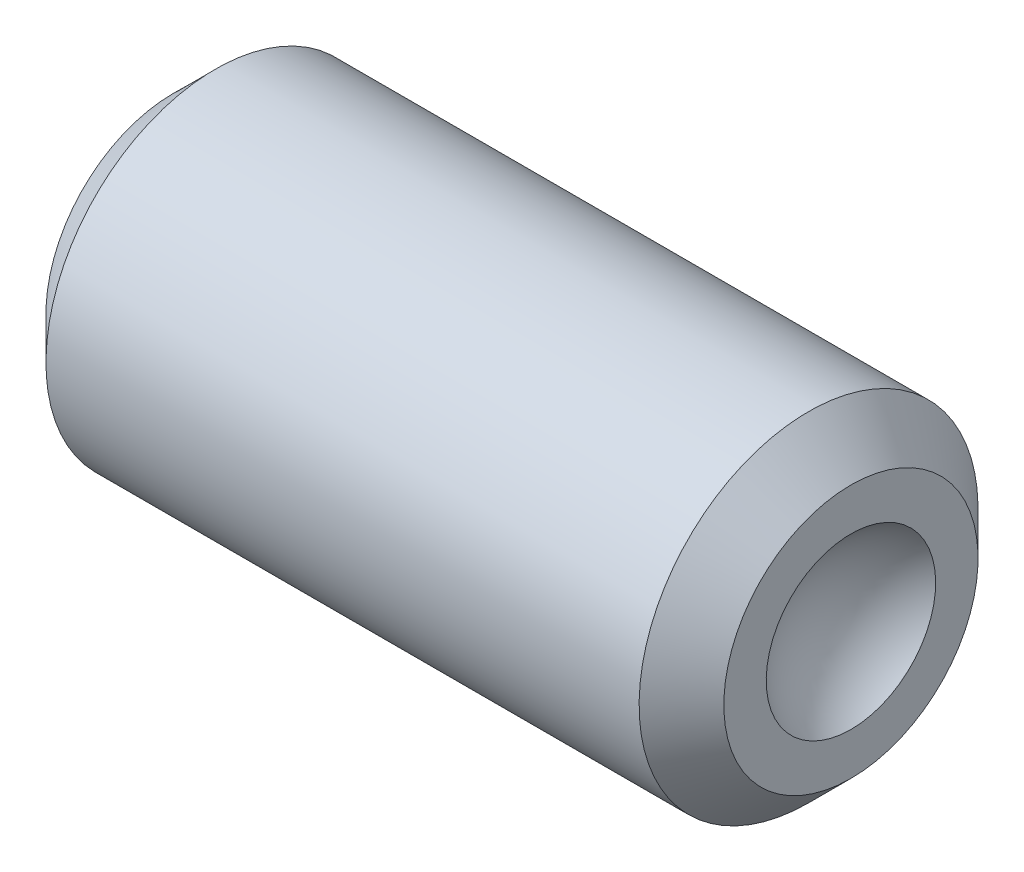
ISO-10303-21;
HEADER;
FILE_DESCRIPTION(('STEP AP214'),'2;1');
FILE_NAME('part.step','',(''),(''),'','','');
FILE_SCHEMA(('AUTOMOTIVE_DESIGN { 1 0 10303 214 1 1 1 1 }'));
ENDSEC;
DATA;
#1=APPLICATION_CONTEXT('core data for automotive mechanical design processes');
#2=APPLICATION_PROTOCOL_DEFINITION('international standard','automotive_design',2000,#1);
#3=PRODUCT_CONTEXT('',#1,'mechanical');
#4=PRODUCT('Part','Part','',(#3));
#5=PRODUCT_RELATED_PRODUCT_CATEGORY('part','',(#4));
#6=PRODUCT_DEFINITION_FORMATION('','',#4);
#7=PRODUCT_DEFINITION_CONTEXT('part definition',#1,'design');
#8=PRODUCT_DEFINITION('design','',#6,#7);
#9=PRODUCT_DEFINITION_SHAPE('','',#8);
#10=(LENGTH_UNIT() NAMED_UNIT(*) SI_UNIT(.MILLI.,.METRE.));
#11=(NAMED_UNIT(*) PLANE_ANGLE_UNIT() SI_UNIT($,.RADIAN.));
#12=(NAMED_UNIT(*) SI_UNIT($,.STERADIAN.) SOLID_ANGLE_UNIT());
#13=UNCERTAINTY_MEASURE_WITH_UNIT(LENGTH_MEASURE(1.E-05),#10,'distance_accuracy_value','');
#14=(GEOMETRIC_REPRESENTATION_CONTEXT(3) GLOBAL_UNCERTAINTY_ASSIGNED_CONTEXT((#13)) GLOBAL_UNIT_ASSIGNED_CONTEXT((#10,
#11,#12)) REPRESENTATION_CONTEXT('',''));
#15=CARTESIAN_POINT('',(0.,0.,0.));
#16=DIRECTION('',(0.,0.,1.));
#17=DIRECTION('',(1.,0.,0.));
#18=AXIS2_PLACEMENT_3D('',#15,#16,#17);
#19=CARTESIAN_POINT('',(0.,0.,0.));
#20=DIRECTION('',(1.,0.,0.));
#21=DIRECTION('',(0.,1.,0.));
#22=AXIS2_PLACEMENT_3D('',#19,#20,#21);
#23=PLANE('',#22);
#24=DIRECTION('',(0.,-0.5,-0.866025403784439));
#25=VECTOR('',#24,1.);
#26=CARTESIAN_POINT('',(0.,1.15470053837925,0.));
#27=LINE('',#26,#25);
#28=CARTESIAN_POINT('',(0.,1.15470053837925,0.));
#29=VERTEX_POINT('',#28);
#30=CARTESIAN_POINT('',(0.,0.577350269189626,-1.));
#31=VERTEX_POINT('',#30);
#32=EDGE_CURVE('E107',#29,#31,#27,.T.);
#33=ORIENTED_EDGE('',*,*,#32,.F.);
#34=DIRECTION('',(0.,0.5,-0.866025403784438));
#35=VECTOR('',#34,1.);
#36=CARTESIAN_POINT('',(0.,0.577350269189626,1.));
#37=LINE('',#36,#35);
#38=CARTESIAN_POINT('',(0.,0.577350269189626,1.));
#39=VERTEX_POINT('',#38);
#40=EDGE_CURVE('E49',#39,#29,#37,.T.);
#41=ORIENTED_EDGE('',*,*,#40,.F.);
#42=DIRECTION('',(0.,1.,0.));
#43=VECTOR('',#42,1.);
#44=CARTESIAN_POINT('',(0.,-0.577350269189626,1.));
#45=LINE('',#44,#43);
#46=CARTESIAN_POINT('',(0.,-0.577350269189626,1.));
#47=VERTEX_POINT('',#46);
#48=EDGE_CURVE('E122',#47,#39,#45,.T.);
#49=ORIENTED_EDGE('',*,*,#48,.F.);
#50=DIRECTION('',(0.,0.5,0.866025403784439));
#51=VECTOR('',#50,1.);
#52=CARTESIAN_POINT('',(0.,-1.15470053837925,0.));
#53=LINE('',#52,#51);
#54=CARTESIAN_POINT('',(0.,-1.15470053837925,0.));
#55=VERTEX_POINT('',#54);
#56=EDGE_CURVE('E116',#55,#47,#53,.T.);
#57=ORIENTED_EDGE('',*,*,#56,.F.);
#58=DIRECTION('',(0.,-0.5,0.866025403784438));
#59=VECTOR('',#58,1.);
#60=CARTESIAN_POINT('',(0.,-0.577350269189625,-1.));
#61=LINE('',#60,#59);
#62=CARTESIAN_POINT('',(0.,-0.577350269189625,-1.));
#63=VERTEX_POINT('',#62);
#64=EDGE_CURVE('E114',#63,#55,#61,.T.);
#65=ORIENTED_EDGE('',*,*,#64,.F.);
#66=DIRECTION('',(0.,-1.,0.));
#67=VECTOR('',#66,1.);
#68=CARTESIAN_POINT('',(0.,0.577350269189626,-1.));
#69=LINE('',#68,#67);
#70=EDGE_CURVE('E100',#31,#63,#69,.T.);
#71=ORIENTED_EDGE('',*,*,#70,.F.);
#72=EDGE_LOOP('',(#33,#41,#49,#57,#65,#71));
#73=FACE_BOUND('',#72,.T.);
#74=CARTESIAN_POINT('',(0.,0.,0.));
#75=DIRECTION('',(-1.,0.,0.));
#76=DIRECTION('',(0.,-1.,0.));
#77=AXIS2_PLACEMENT_3D('',#74,#75,#76);
#78=CIRCLE('',#77,1.5);
#79=CARTESIAN_POINT('',(0.,-1.5,0.));
#80=VERTEX_POINT('',#79);
#81=EDGE_CURVE('E12',#80,#80,#78,.T.);
#82=ORIENTED_EDGE('',*,*,#81,.T.);
#83=EDGE_LOOP('',(#82));
#84=FACE_BOUND('',#83,.T.);
#85=ADVANCED_FACE('F35',(#73,#84),#23,.F.);
#86=CARTESIAN_POINT('',(0.500000000000001,0.,0.));
#87=DIRECTION('',(1.,0.,0.));
#88=DIRECTION('',(0.,1.,0.));
#89=AXIS2_PLACEMENT_3D('',#86,#87,#88);
#90=CONICAL_SURFACE('',#89,2.,0.785398163397447);
#91=ORIENTED_EDGE('',*,*,#81,.F.);
#92=EDGE_LOOP('',(#91));
#93=FACE_BOUND('',#92,.T.);
#94=CARTESIAN_POINT('',(0.500000000000001,0.,0.));
#95=DIRECTION('',(-1.,0.,0.));
#96=DIRECTION('',(0.,-1.,0.));
#97=AXIS2_PLACEMENT_3D('',#94,#95,#96);
#98=CIRCLE('',#97,2.);
#99=CARTESIAN_POINT('',(0.500000000000001,-2.,0.));
#100=VERTEX_POINT('',#99);
#101=EDGE_CURVE('E42',#100,#100,#98,.T.);
#102=ORIENTED_EDGE('',*,*,#101,.T.);
#103=EDGE_LOOP('',(#102));
#104=FACE_BOUND('',#103,.T.);
#105=ADVANCED_FACE('F145',(#93,#104),#90,.T.);
#106=CARTESIAN_POINT('',(0.,0.,0.));
#107=DIRECTION('',(-1.,0.,0.));
#108=DIRECTION('',(0.,-1.,0.));
#109=AXIS2_PLACEMENT_3D('',#106,#107,#108);
#110=CYLINDRICAL_SURFACE('',#109,2.);
#111=ORIENTED_EDGE('',*,*,#101,.F.);
#112=EDGE_LOOP('',(#111));
#113=FACE_BOUND('',#112,.T.);
#114=CARTESIAN_POINT('',(7.5,0.,0.));
#115=DIRECTION('',(-1.,0.,0.));
#116=DIRECTION('',(0.,-1.,0.));
#117=AXIS2_PLACEMENT_3D('',#114,#115,#116);
#118=CIRCLE('',#117,2.);
#119=CARTESIAN_POINT('',(7.5,-2.,0.));
#120=VERTEX_POINT('',#119);
#121=EDGE_CURVE('E140',#120,#120,#118,.T.);
#122=ORIENTED_EDGE('',*,*,#121,.T.);
#123=EDGE_LOOP('',(#122));
#124=FACE_BOUND('',#123,.T.);
#125=ADVANCED_FACE('F147',(#113,#124),#110,.T.);
#126=CARTESIAN_POINT('',(8.,0.,0.));
#127=DIRECTION('',(-1.,0.,0.));
#128=DIRECTION('',(0.,-1.,0.));
#129=AXIS2_PLACEMENT_3D('',#126,#127,#128);
#130=CONICAL_SURFACE('',#129,1.5,0.785398163397448);
#131=ORIENTED_EDGE('',*,*,#121,.F.);
#132=EDGE_LOOP('',(#131));
#133=FACE_BOUND('',#132,.T.);
#134=CARTESIAN_POINT('',(8.,0.,0.));
#135=DIRECTION('',(-1.,0.,0.));
#136=DIRECTION('',(0.,-1.,0.));
#137=AXIS2_PLACEMENT_3D('',#134,#135,#136);
#138=CIRCLE('',#137,1.5);
#139=CARTESIAN_POINT('',(8.,-1.5,0.));
#140=VERTEX_POINT('',#139);
#141=EDGE_CURVE('E137',#140,#140,#138,.T.);
#142=ORIENTED_EDGE('',*,*,#141,.T.);
#143=EDGE_LOOP('',(#142));
#144=FACE_BOUND('',#143,.T.);
#145=ADVANCED_FACE('F150',(#133,#144),#130,.T.);
#146=CARTESIAN_POINT('',(8.,1.5,0.));
#147=DIRECTION('',(-1.,0.,0.));
#148=DIRECTION('',(0.,-1.,0.));
#149=AXIS2_PLACEMENT_3D('',#146,#147,#148);
#150=PLANE('',#149);
#151=ORIENTED_EDGE('',*,*,#141,.F.);
#152=EDGE_LOOP('',(#151));
#153=FACE_BOUND('',#152,.T.);
#154=CARTESIAN_POINT('',(8.,0.,0.));
#155=DIRECTION('',(-1.,0.,0.));
#156=DIRECTION('',(0.,-1.,0.));
#157=AXIS2_PLACEMENT_3D('',#154,#155,#156);
#158=CIRCLE('',#157,1.);
#159=CARTESIAN_POINT('',(8.,-1.,0.));
#160=VERTEX_POINT('',#159);
#161=EDGE_CURVE('E134',#160,#160,#158,.T.);
#162=ORIENTED_EDGE('',*,*,#161,.T.);
#163=EDGE_LOOP('',(#162));
#164=FACE_BOUND('',#163,.T.);
#165=ADVANCED_FACE('F156',(#153,#164),#150,.F.);
#166=CARTESIAN_POINT('',(8.75,0.,0.));
#167=DIRECTION('',(-1.,0.,0.));
#168=DIRECTION('',(0.,-1.,0.));
#169=AXIS2_PLACEMENT_3D('',#166,#167,#168);
#170=SPHERICAL_SURFACE('',#169,1.25);
#171=ORIENTED_EDGE('',*,*,#161,.F.);
#172=EDGE_LOOP('',(#171));
#173=FACE_BOUND('',#172,.T.);
#174=ADVANCED_FACE('F162',(#173),#170,.F.);
#175=CARTESIAN_POINT('',(11.0550504633039,0.577350269189626,1.));
#176=DIRECTION('',(0.,0.866025403784439,0.5));
#177=DIRECTION('',(0.,-0.5,0.866025403784439));
#178=AXIS2_PLACEMENT_3D('',#175,#176,#177);
#179=PLANE('',#178);
#180=DIRECTION('',(0.,-0.5,0.866025403784439));
#181=VECTOR('',#180,1.);
#182=CARTESIAN_POINT('',(6.,0.577350269189626,1.));
#183=LINE('',#182,#181);
#184=CARTESIAN_POINT('',(6.,1.15470053837925,0.));
#185=VERTEX_POINT('',#184);
#186=CARTESIAN_POINT('',(6.,0.577350269189626,1.));
#187=VERTEX_POINT('',#186);
#188=EDGE_CURVE('E68',#185,#187,#183,.T.);
#189=ORIENTED_EDGE('',*,*,#188,.T.);
#190=DIRECTION('',(-1.,0.,0.));
#191=VECTOR('',#190,1.);
#192=CARTESIAN_POINT('',(11.0550504633039,0.577350269189626,1.));
#193=LINE('',#192,#191);
#194=EDGE_CURVE('E125',#187,#39,#193,.T.);
#195=ORIENTED_EDGE('',*,*,#194,.T.);
#196=ORIENTED_EDGE('',*,*,#40,.T.);
#197=DIRECTION('',(-1.,0.,0.));
#198=VECTOR('',#197,1.);
#199=CARTESIAN_POINT('',(11.0550504633039,1.15470053837925,0.));
#200=LINE('',#199,#198);
#201=EDGE_CURVE('E104',#185,#29,#200,.T.);
#202=ORIENTED_EDGE('',*,*,#201,.F.);
#203=EDGE_LOOP('',(#189,#195,#196,#202));
#204=FACE_BOUND('',#203,.T.);
#205=ADVANCED_FACE('F167',(#204),#179,.F.);
#206=CARTESIAN_POINT('',(11.0550504633039,-0.577350269189626,1.));
#207=DIRECTION('',(0.,0.,1.));
#208=DIRECTION('',(1.,0.,0.));
#209=AXIS2_PLACEMENT_3D('',#206,#207,#208);
#210=PLANE('',#209);
#211=DIRECTION('',(0.,-1.,0.));
#212=VECTOR('',#211,1.);
#213=CARTESIAN_POINT('',(6.,-0.577350269189626,1.));
#214=LINE('',#213,#212);
#215=CARTESIAN_POINT('',(6.,-0.577350269189626,1.));
#216=VERTEX_POINT('',#215);
#217=EDGE_CURVE('E267',#187,#216,#214,.T.);
#218=ORIENTED_EDGE('',*,*,#217,.T.);
#219=DIRECTION('',(-1.,0.,0.));
#220=VECTOR('',#219,1.);
#221=CARTESIAN_POINT('',(11.0550504633039,-0.577350269189626,1.));
#222=LINE('',#221,#220);
#223=EDGE_CURVE('E127',#216,#47,#222,.T.);
#224=ORIENTED_EDGE('',*,*,#223,.T.);
#225=ORIENTED_EDGE('',*,*,#48,.T.);
#226=ORIENTED_EDGE('',*,*,#194,.F.);
#227=EDGE_LOOP('',(#218,#224,#225,#226));
#228=FACE_BOUND('',#227,.T.);
#229=ADVANCED_FACE('F172',(#228),#210,.F.);
#230=CARTESIAN_POINT('',(11.0550504633039,-1.15470053837925,0.));
#231=DIRECTION('',(0.,-0.866025403784439,0.5));
#232=DIRECTION('',(0.,-0.5,-0.866025403784439));
#233=AXIS2_PLACEMENT_3D('',#230,#231,#232);
#234=PLANE('',#233);
#235=DIRECTION('',(0.,-0.5,-0.866025403784439));
#236=VECTOR('',#235,1.);
#237=CARTESIAN_POINT('',(6.,-1.15470053837925,0.));
#238=LINE('',#237,#236);
#239=CARTESIAN_POINT('',(6.,-1.15470053837925,0.));
#240=VERTEX_POINT('',#239);
#241=EDGE_CURVE('E270',#216,#240,#238,.T.);
#242=ORIENTED_EDGE('',*,*,#241,.T.);
#243=DIRECTION('',(-1.,0.,0.));
#244=VECTOR('',#243,1.);
#245=CARTESIAN_POINT('',(11.0550504633039,-1.15470053837925,0.));
#246=LINE('',#245,#244);
#247=EDGE_CURVE('E129',#240,#55,#246,.T.);
#248=ORIENTED_EDGE('',*,*,#247,.T.);
#249=ORIENTED_EDGE('',*,*,#56,.T.);
#250=ORIENTED_EDGE('',*,*,#223,.F.);
#251=EDGE_LOOP('',(#242,#248,#249,#250));
#252=FACE_BOUND('',#251,.T.);
#253=ADVANCED_FACE('F217',(#252),#234,.F.);
#254=CARTESIAN_POINT('',(11.0550504633039,-0.577350269189626,-1.));
#255=DIRECTION('',(0.,-0.866025403784439,-0.5));
#256=DIRECTION('',(0.,0.5,-0.866025403784439));
#257=AXIS2_PLACEMENT_3D('',#254,#255,#256);
#258=PLANE('',#257);
#259=DIRECTION('',(0.,0.5,-0.866025403784439));
#260=VECTOR('',#259,1.);
#261=CARTESIAN_POINT('',(6.,-0.577350269189625,-1.));
#262=LINE('',#261,#260);
#263=CARTESIAN_POINT('',(6.,-0.577350269189626,-1.));
#264=VERTEX_POINT('',#263);
#265=EDGE_CURVE('E58',#240,#264,#262,.T.);
#266=ORIENTED_EDGE('',*,*,#265,.T.);
#267=DIRECTION('',(-1.,0.,0.));
#268=VECTOR('',#267,1.);
#269=CARTESIAN_POINT('',(11.0550504633039,-0.577350269189626,-1.));
#270=LINE('',#269,#268);
#271=EDGE_CURVE('E103',#264,#63,#270,.T.);
#272=ORIENTED_EDGE('',*,*,#271,.T.);
#273=ORIENTED_EDGE('',*,*,#64,.T.);
#274=ORIENTED_EDGE('',*,*,#247,.F.);
#275=EDGE_LOOP('',(#266,#272,#273,#274));
#276=FACE_BOUND('',#275,.T.);
#277=ADVANCED_FACE('F227',(#276),#258,.F.);
#278=CARTESIAN_POINT('',(11.0550504633039,0.577350269189626,-1.));
#279=DIRECTION('',(0.,0.,-1.));
#280=DIRECTION('',(-1.,0.,0.));
#281=AXIS2_PLACEMENT_3D('',#278,#279,#280);
#282=PLANE('',#281);
#283=DIRECTION('',(0.,1.,0.));
#284=VECTOR('',#283,1.);
#285=CARTESIAN_POINT('',(6.,0.577350269189626,-1.));
#286=LINE('',#285,#284);
#287=CARTESIAN_POINT('',(6.,0.577350269189626,-1.));
#288=VERTEX_POINT('',#287);
#289=EDGE_CURVE('E102',#264,#288,#286,.T.);
#290=ORIENTED_EDGE('',*,*,#289,.T.);
#291=DIRECTION('',(-1.,0.,0.));
#292=VECTOR('',#291,1.);
#293=CARTESIAN_POINT('',(11.0550504633039,0.577350269189626,-1.));
#294=LINE('',#293,#292);
#295=EDGE_CURVE('E95',#288,#31,#294,.T.);
#296=ORIENTED_EDGE('',*,*,#295,.T.);
#297=ORIENTED_EDGE('',*,*,#70,.T.);
#298=ORIENTED_EDGE('',*,*,#271,.F.);
#299=EDGE_LOOP('',(#290,#296,#297,#298));
#300=FACE_BOUND('',#299,.T.);
#301=ADVANCED_FACE('F97',(#300),#282,.F.);
#302=CARTESIAN_POINT('',(11.0550504633039,1.15470053837925,0.));
#303=DIRECTION('',(0.,0.866025403784439,-0.5));
#304=DIRECTION('',(0.,0.5,0.866025403784439));
#305=AXIS2_PLACEMENT_3D('',#302,#303,#304);
#306=PLANE('',#305);
#307=DIRECTION('',(0.,0.5,0.866025403784439));
#308=VECTOR('',#307,1.);
#309=CARTESIAN_POINT('',(6.,1.15470053837925,0.));
#310=LINE('',#309,#308);
#311=EDGE_CURVE('E77',#288,#185,#310,.T.);
#312=ORIENTED_EDGE('',*,*,#311,.T.);
#313=ORIENTED_EDGE('',*,*,#201,.T.);
#314=ORIENTED_EDGE('',*,*,#32,.T.);
#315=ORIENTED_EDGE('',*,*,#295,.F.);
#316=EDGE_LOOP('',(#312,#313,#314,#315));
#317=FACE_BOUND('',#316,.T.);
#318=ADVANCED_FACE('F108',(#317),#306,.F.);
#319=CARTESIAN_POINT('',(6.,1.5,0.));
#320=DIRECTION('',(-1.,0.,0.));
#321=DIRECTION('',(0.,-1.,0.));
#322=AXIS2_PLACEMENT_3D('',#319,#320,#321);
#323=PLANE('',#322);
#324=ORIENTED_EDGE('',*,*,#188,.F.);
#325=ORIENTED_EDGE('',*,*,#311,.F.);
#326=ORIENTED_EDGE('',*,*,#289,.F.);
#327=ORIENTED_EDGE('',*,*,#265,.F.);
#328=ORIENTED_EDGE('',*,*,#241,.F.);
#329=ORIENTED_EDGE('',*,*,#217,.F.);
#330=EDGE_LOOP('',(#324,#325,#326,#327,#328,#329));
#331=FACE_BOUND('',#330,.T.);
#332=ADVANCED_FACE('F253',(#331),#323,.T.);
#333=CLOSED_SHELL('',(#85,#105,#125,#145,#165,#174,#205,#229,#253,#277,#301,#318,#332));
#334=MANIFOLD_SOLID_BREP('B2',#333);
#335=ADVANCED_BREP_SHAPE_REPRESENTATION('',(#18,#334),#14);
#336=SHAPE_DEFINITION_REPRESENTATION(#9,#335);
ENDSEC;
END-ISO-10303-21;
